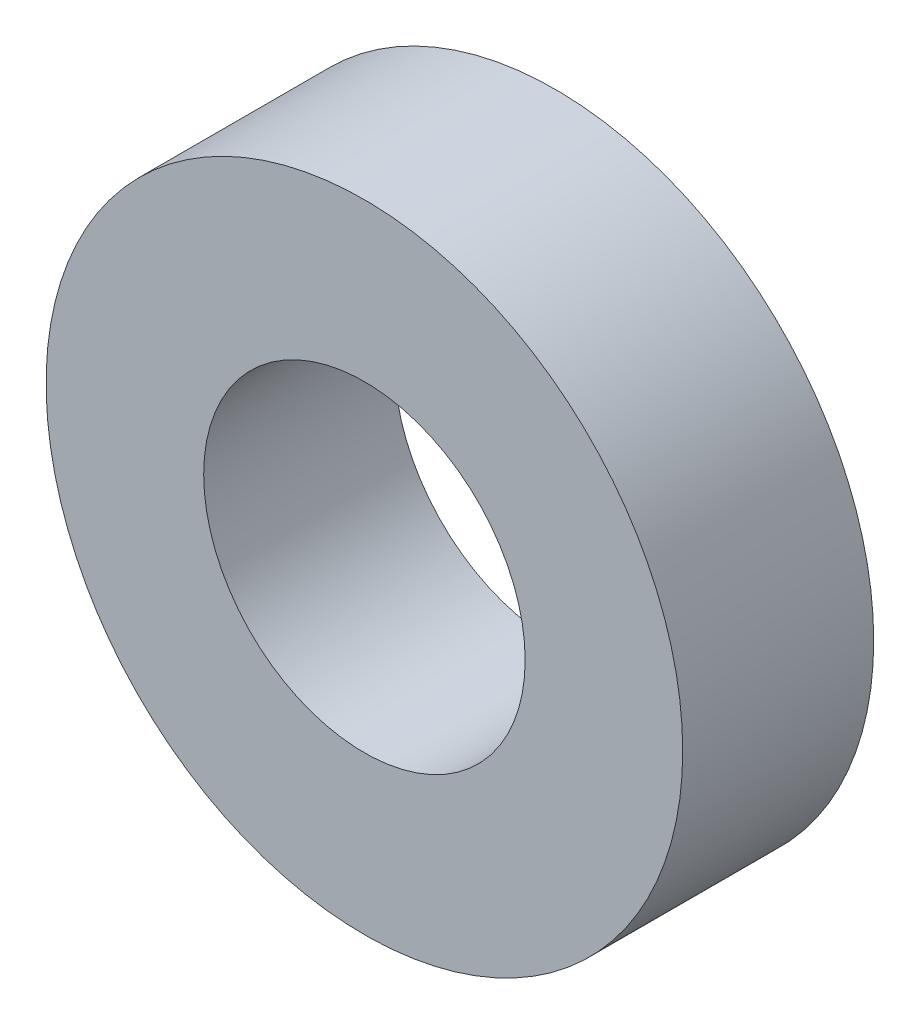
ISO-10303-21;
HEADER;
FILE_DESCRIPTION(('STEP AP214'),'2;1');
FILE_NAME('part.step','',(''),(''),'','','');
FILE_SCHEMA(('AUTOMOTIVE_DESIGN { 1 0 10303 214 1 1 1 1 }'));
ENDSEC;
DATA;
#1=APPLICATION_CONTEXT('core data for automotive mechanical design processes');
#2=APPLICATION_PROTOCOL_DEFINITION('international standard','automotive_design',2000,#1);
#3=PRODUCT_CONTEXT('',#1,'mechanical');
#4=PRODUCT('Part','Part','',(#3));
#5=PRODUCT_RELATED_PRODUCT_CATEGORY('part','',(#4));
#6=PRODUCT_DEFINITION_FORMATION('','',#4);
#7=PRODUCT_DEFINITION_CONTEXT('part definition',#1,'design');
#8=PRODUCT_DEFINITION('design','',#6,#7);
#9=PRODUCT_DEFINITION_SHAPE('','',#8);
#10=(LENGTH_UNIT() NAMED_UNIT(*) SI_UNIT(.MILLI.,.METRE.));
#11=(NAMED_UNIT(*) PLANE_ANGLE_UNIT() SI_UNIT($,.RADIAN.));
#12=(NAMED_UNIT(*) SI_UNIT($,.STERADIAN.) SOLID_ANGLE_UNIT());
#13=UNCERTAINTY_MEASURE_WITH_UNIT(LENGTH_MEASURE(1.E-05),#10,'distance_accuracy_value','');
#14=(GEOMETRIC_REPRESENTATION_CONTEXT(3) GLOBAL_UNCERTAINTY_ASSIGNED_CONTEXT((#13)) GLOBAL_UNIT_ASSIGNED_CONTEXT((#10,
#11,#12)) REPRESENTATION_CONTEXT('',''));
#15=CARTESIAN_POINT('',(0.,0.,0.));
#16=DIRECTION('',(0.,0.,1.));
#17=DIRECTION('',(1.,0.,0.));
#18=AXIS2_PLACEMENT_3D('',#15,#16,#17);
#19=CARTESIAN_POINT('',(0.,0.,1.8));
#20=DIRECTION('',(0.,0.,1.));
#21=DIRECTION('',(1.,0.,0.));
#22=AXIS2_PLACEMENT_3D('',#19,#20,#21);
#23=PLANE('',#22);
#24=CARTESIAN_POINT('',(0.,0.,1.8));
#25=DIRECTION('',(0.,0.,1.));
#26=DIRECTION('',(1.,0.,0.));
#27=AXIS2_PLACEMENT_3D('',#24,#25,#26);
#28=CIRCLE('',#27,3.);
#29=CARTESIAN_POINT('',(3.,0.,1.8));
#30=VERTEX_POINT('',#29);
#31=EDGE_CURVE('E10',#30,#30,#28,.T.);
#32=ORIENTED_EDGE('',*,*,#31,.T.);
#33=EDGE_LOOP('',(#32));
#34=FACE_BOUND('',#33,.T.);
#35=CARTESIAN_POINT('',(0.,0.,1.8));
#36=DIRECTION('',(0.,0.,1.));
#37=DIRECTION('',(1.,0.,0.));
#38=AXIS2_PLACEMENT_3D('',#35,#36,#37);
#39=CIRCLE('',#38,1.515);
#40=CARTESIAN_POINT('',(1.515,0.,1.8));
#41=VERTEX_POINT('',#40);
#42=EDGE_CURVE('E50',#41,#41,#39,.T.);
#43=ORIENTED_EDGE('',*,*,#42,.F.);
#44=EDGE_LOOP('',(#43));
#45=FACE_BOUND('',#44,.T.);
#46=ADVANCED_FACE('F37',(#34,#45),#23,.T.);
#47=CARTESIAN_POINT('',(0.,0.,0.));
#48=DIRECTION('',(0.,0.,1.));
#49=DIRECTION('',(1.,0.,0.));
#50=AXIS2_PLACEMENT_3D('',#47,#48,#49);
#51=PLANE('',#50);
#52=CARTESIAN_POINT('',(0.,0.,0.));
#53=DIRECTION('',(0.,0.,1.));
#54=DIRECTION('',(1.,0.,0.));
#55=AXIS2_PLACEMENT_3D('',#52,#53,#54);
#56=CIRCLE('',#55,3.);
#57=CARTESIAN_POINT('',(3.,0.,0.));
#58=VERTEX_POINT('',#57);
#59=EDGE_CURVE('E41',#58,#58,#56,.T.);
#60=ORIENTED_EDGE('',*,*,#59,.F.);
#61=EDGE_LOOP('',(#60));
#62=FACE_BOUND('',#61,.T.);
#63=CARTESIAN_POINT('',(0.,0.,0.));
#64=DIRECTION('',(0.,0.,1.));
#65=DIRECTION('',(1.,0.,0.));
#66=AXIS2_PLACEMENT_3D('',#63,#64,#65);
#67=CIRCLE('',#66,1.515);
#68=CARTESIAN_POINT('',(1.515,0.,0.));
#69=VERTEX_POINT('',#68);
#70=EDGE_CURVE('E52',#69,#69,#67,.T.);
#71=ORIENTED_EDGE('',*,*,#70,.T.);
#72=EDGE_LOOP('',(#71));
#73=FACE_BOUND('',#72,.T.);
#74=ADVANCED_FACE('F64',(#62,#73),#51,.F.);
#75=CARTESIAN_POINT('',(0.,0.,1.8));
#76=DIRECTION('',(0.,0.,-1.));
#77=DIRECTION('',(-1.,0.,0.));
#78=AXIS2_PLACEMENT_3D('',#75,#76,#77);
#79=CYLINDRICAL_SURFACE('',#78,3.);
#80=ORIENTED_EDGE('',*,*,#31,.F.);
#81=EDGE_LOOP('',(#80));
#82=FACE_BOUND('',#81,.T.);
#83=ORIENTED_EDGE('',*,*,#59,.T.);
#84=EDGE_LOOP('',(#83));
#85=FACE_BOUND('',#84,.T.);
#86=ADVANCED_FACE('F39',(#82,#85),#79,.T.);
#87=CARTESIAN_POINT('',(0.,0.,1.8));
#88=DIRECTION('',(0.,0.,-1.));
#89=DIRECTION('',(-1.,0.,0.));
#90=AXIS2_PLACEMENT_3D('',#87,#88,#89);
#91=CYLINDRICAL_SURFACE('',#90,1.515);
#92=ORIENTED_EDGE('',*,*,#42,.T.);
#93=EDGE_LOOP('',(#92));
#94=FACE_BOUND('',#93,.T.);
#95=ORIENTED_EDGE('',*,*,#70,.F.);
#96=EDGE_LOOP('',(#95));
#97=FACE_BOUND('',#96,.T.);
#98=ADVANCED_FACE('F60',(#94,#97),#91,.F.);
#99=CLOSED_SHELL('',(#46,#74,#86,#98));
#100=MANIFOLD_SOLID_BREP('B2',#99);
#101=ADVANCED_BREP_SHAPE_REPRESENTATION('',(#18,#100),#14);
#102=SHAPE_DEFINITION_REPRESENTATION(#9,#101);
ENDSEC;
END-ISO-10303-21;
